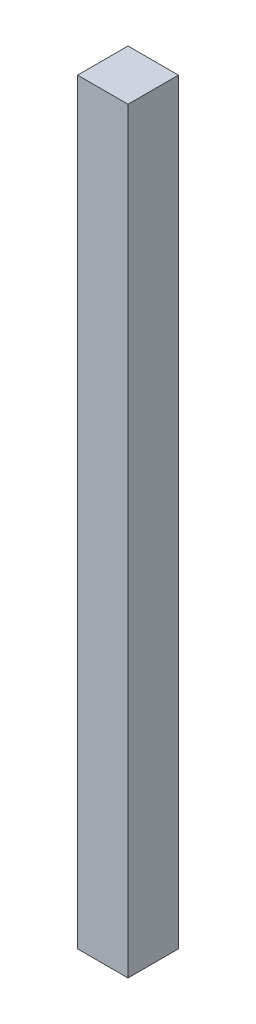
ISO-10303-21;
HEADER;
FILE_DESCRIPTION(('STEP AP214'),'2;1');
FILE_NAME('part.step','',(''),(''),'','','');
FILE_SCHEMA(('AUTOMOTIVE_DESIGN { 1 0 10303 214 1 1 1 1 }'));
ENDSEC;
DATA;
#1=APPLICATION_CONTEXT('core data for automotive mechanical design processes');
#2=APPLICATION_PROTOCOL_DEFINITION('international standard','automotive_design',2000,#1);
#3=PRODUCT_CONTEXT('',#1,'mechanical');
#4=PRODUCT('Part','Part','',(#3));
#5=PRODUCT_RELATED_PRODUCT_CATEGORY('part','',(#4));
#6=PRODUCT_DEFINITION_FORMATION('','',#4);
#7=PRODUCT_DEFINITION_CONTEXT('part definition',#1,'design');
#8=PRODUCT_DEFINITION('design','',#6,#7);
#9=PRODUCT_DEFINITION_SHAPE('','',#8);
#10=(LENGTH_UNIT() NAMED_UNIT(*) SI_UNIT(.MILLI.,.METRE.));
#11=(NAMED_UNIT(*) PLANE_ANGLE_UNIT() SI_UNIT($,.RADIAN.));
#12=(NAMED_UNIT(*) SI_UNIT($,.STERADIAN.) SOLID_ANGLE_UNIT());
#13=UNCERTAINTY_MEASURE_WITH_UNIT(LENGTH_MEASURE(1.E-05),#10,'distance_accuracy_value','');
#14=(GEOMETRIC_REPRESENTATION_CONTEXT(3) GLOBAL_UNCERTAINTY_ASSIGNED_CONTEXT((#13)) GLOBAL_UNIT_ASSIGNED_CONTEXT((#10,
#11,#12)) REPRESENTATION_CONTEXT('',''));
#15=CARTESIAN_POINT('',(0.,0.,0.));
#16=DIRECTION('',(0.,0.,1.));
#17=DIRECTION('',(1.,0.,0.));
#18=AXIS2_PLACEMENT_3D('',#15,#16,#17);
#19=CARTESIAN_POINT('',(0.,300.,0.));
#20=DIRECTION('',(1.,0.,0.));
#21=DIRECTION('',(0.,0.,-1.));
#22=AXIS2_PLACEMENT_3D('',#19,#20,#21);
#23=PLANE('',#22);
#24=DIRECTION('',(0.,0.,1.));
#25=VECTOR('',#24,1.);
#26=CARTESIAN_POINT('',(0.,0.,0.));
#27=LINE('',#26,#25);
#28=CARTESIAN_POINT('',(0.,0.,0.));
#29=VERTEX_POINT('',#28);
#30=CARTESIAN_POINT('',(0.,0.,20.));
#31=VERTEX_POINT('',#30);
#32=EDGE_CURVE('E96',#29,#31,#27,.T.);
#33=ORIENTED_EDGE('',*,*,#32,.T.);
#34=DIRECTION('',(0.,-1.,0.));
#35=VECTOR('',#34,1.);
#36=CARTESIAN_POINT('',(0.,300.,20.));
#37=LINE('',#36,#35);
#38=CARTESIAN_POINT('',(0.,300.,20.));
#39=VERTEX_POINT('',#38);
#40=EDGE_CURVE('E11',#39,#31,#37,.T.);
#41=ORIENTED_EDGE('',*,*,#40,.F.);
#42=DIRECTION('',(0.,0.,1.));
#43=VECTOR('',#42,1.);
#44=CARTESIAN_POINT('',(0.,300.,0.));
#45=LINE('',#44,#43);
#46=CARTESIAN_POINT('',(0.,300.,0.));
#47=VERTEX_POINT('',#46);
#48=EDGE_CURVE('E84',#47,#39,#45,.T.);
#49=ORIENTED_EDGE('',*,*,#48,.F.);
#50=DIRECTION('',(0.,-1.,0.));
#51=VECTOR('',#50,1.);
#52=CARTESIAN_POINT('',(0.,300.,0.));
#53=LINE('',#52,#51);
#54=EDGE_CURVE('E92',#47,#29,#53,.T.);
#55=ORIENTED_EDGE('',*,*,#54,.T.);
#56=EDGE_LOOP('',(#33,#41,#49,#55));
#57=FACE_BOUND('',#56,.T.);
#58=ADVANCED_FACE('F33',(#57),#23,.F.);
#59=CARTESIAN_POINT('',(0.,300.,20.));
#60=DIRECTION('',(0.,0.,-1.));
#61=DIRECTION('',(-1.,0.,0.));
#62=AXIS2_PLACEMENT_3D('',#59,#60,#61);
#63=PLANE('',#62);
#64=DIRECTION('',(1.,0.,0.));
#65=VECTOR('',#64,1.);
#66=CARTESIAN_POINT('',(0.,0.,20.));
#67=LINE('',#66,#65);
#68=CARTESIAN_POINT('',(20.,0.,20.));
#69=VERTEX_POINT('',#68);
#70=EDGE_CURVE('E88',#31,#69,#67,.T.);
#71=ORIENTED_EDGE('',*,*,#70,.T.);
#72=DIRECTION('',(0.,-1.,0.));
#73=VECTOR('',#72,1.);
#74=CARTESIAN_POINT('',(20.,300.,20.));
#75=LINE('',#74,#73);
#76=CARTESIAN_POINT('',(20.,300.,20.));
#77=VERTEX_POINT('',#76);
#78=EDGE_CURVE('E41',#77,#69,#75,.T.);
#79=ORIENTED_EDGE('',*,*,#78,.F.);
#80=DIRECTION('',(1.,0.,0.));
#81=VECTOR('',#80,1.);
#82=CARTESIAN_POINT('',(0.,300.,20.));
#83=LINE('',#82,#81);
#84=EDGE_CURVE('E79',#39,#77,#83,.T.);
#85=ORIENTED_EDGE('',*,*,#84,.F.);
#86=ORIENTED_EDGE('',*,*,#40,.T.);
#87=EDGE_LOOP('',(#71,#79,#85,#86));
#88=FACE_BOUND('',#87,.T.);
#89=ADVANCED_FACE('F87',(#88),#63,.F.);
#90=CARTESIAN_POINT('',(20.,300.,0.));
#91=DIRECTION('',(-1.,0.,0.));
#92=DIRECTION('',(0.,0.,1.));
#93=AXIS2_PLACEMENT_3D('',#90,#91,#92);
#94=PLANE('',#93);
#95=DIRECTION('',(0.,0.,-1.));
#96=VECTOR('',#95,1.);
#97=CARTESIAN_POINT('',(20.,0.,0.));
#98=LINE('',#97,#96);
#99=CARTESIAN_POINT('',(20.,0.,0.));
#100=VERTEX_POINT('',#99);
#101=EDGE_CURVE('E66',#69,#100,#98,.T.);
#102=ORIENTED_EDGE('',*,*,#101,.T.);
#103=DIRECTION('',(0.,-1.,0.));
#104=VECTOR('',#103,1.);
#105=CARTESIAN_POINT('',(20.,300.,0.));
#106=LINE('',#105,#104);
#107=CARTESIAN_POINT('',(20.,300.,0.));
#108=VERTEX_POINT('',#107);
#109=EDGE_CURVE('E89',#108,#100,#106,.T.);
#110=ORIENTED_EDGE('',*,*,#109,.F.);
#111=DIRECTION('',(0.,0.,-1.));
#112=VECTOR('',#111,1.);
#113=CARTESIAN_POINT('',(20.,300.,0.));
#114=LINE('',#113,#112);
#115=EDGE_CURVE('E82',#77,#108,#114,.T.);
#116=ORIENTED_EDGE('',*,*,#115,.F.);
#117=ORIENTED_EDGE('',*,*,#78,.T.);
#118=EDGE_LOOP('',(#102,#110,#116,#117));
#119=FACE_BOUND('',#118,.T.);
#120=ADVANCED_FACE('F90',(#119),#94,.F.);
#121=CARTESIAN_POINT('',(0.,300.,0.));
#122=DIRECTION('',(0.,0.,1.));
#123=DIRECTION('',(1.,0.,0.));
#124=AXIS2_PLACEMENT_3D('',#121,#122,#123);
#125=PLANE('',#124);
#126=DIRECTION('',(-1.,0.,0.));
#127=VECTOR('',#126,1.);
#128=CARTESIAN_POINT('',(0.,0.,0.));
#129=LINE('',#128,#127);
#130=EDGE_CURVE('E72',#100,#29,#129,.T.);
#131=ORIENTED_EDGE('',*,*,#130,.T.);
#132=ORIENTED_EDGE('',*,*,#54,.F.);
#133=DIRECTION('',(-1.,0.,0.));
#134=VECTOR('',#133,1.);
#135=CARTESIAN_POINT('',(0.,300.,0.));
#136=LINE('',#135,#134);
#137=EDGE_CURVE('E49',#108,#47,#136,.T.);
#138=ORIENTED_EDGE('',*,*,#137,.F.);
#139=ORIENTED_EDGE('',*,*,#109,.T.);
#140=EDGE_LOOP('',(#131,#132,#138,#139));
#141=FACE_BOUND('',#140,.T.);
#142=ADVANCED_FACE('F103',(#141),#125,.F.);
#143=CARTESIAN_POINT('',(0.,300.,0.));
#144=DIRECTION('',(0.,1.,0.));
#145=DIRECTION('',(0.,0.,1.));
#146=AXIS2_PLACEMENT_3D('',#143,#144,#145);
#147=PLANE('',#146);
#148=ORIENTED_EDGE('',*,*,#48,.T.);
#149=ORIENTED_EDGE('',*,*,#84,.T.);
#150=ORIENTED_EDGE('',*,*,#115,.T.);
#151=ORIENTED_EDGE('',*,*,#137,.T.);
#152=EDGE_LOOP('',(#148,#149,#150,#151));
#153=FACE_BOUND('',#152,.T.);
#154=ADVANCED_FACE('F80',(#153),#147,.T.);
#155=CARTESIAN_POINT('',(0.,0.,0.));
#156=DIRECTION('',(0.,1.,0.));
#157=DIRECTION('',(0.,0.,1.));
#158=AXIS2_PLACEMENT_3D('',#155,#156,#157);
#159=PLANE('',#158);
#160=ORIENTED_EDGE('',*,*,#32,.F.);
#161=ORIENTED_EDGE('',*,*,#130,.F.);
#162=ORIENTED_EDGE('',*,*,#101,.F.);
#163=ORIENTED_EDGE('',*,*,#70,.F.);
#164=EDGE_LOOP('',(#160,#161,#162,#163));
#165=FACE_BOUND('',#164,.T.);
#166=ADVANCED_FACE('F106',(#165),#159,.F.);
#167=CLOSED_SHELL('',(#58,#89,#120,#142,#154,#166));
#168=MANIFOLD_SOLID_BREP('B2',#167);
#169=ADVANCED_BREP_SHAPE_REPRESENTATION('',(#18,#168),#14);
#170=SHAPE_DEFINITION_REPRESENTATION(#9,#169);
ENDSEC;
END-ISO-10303-21;
